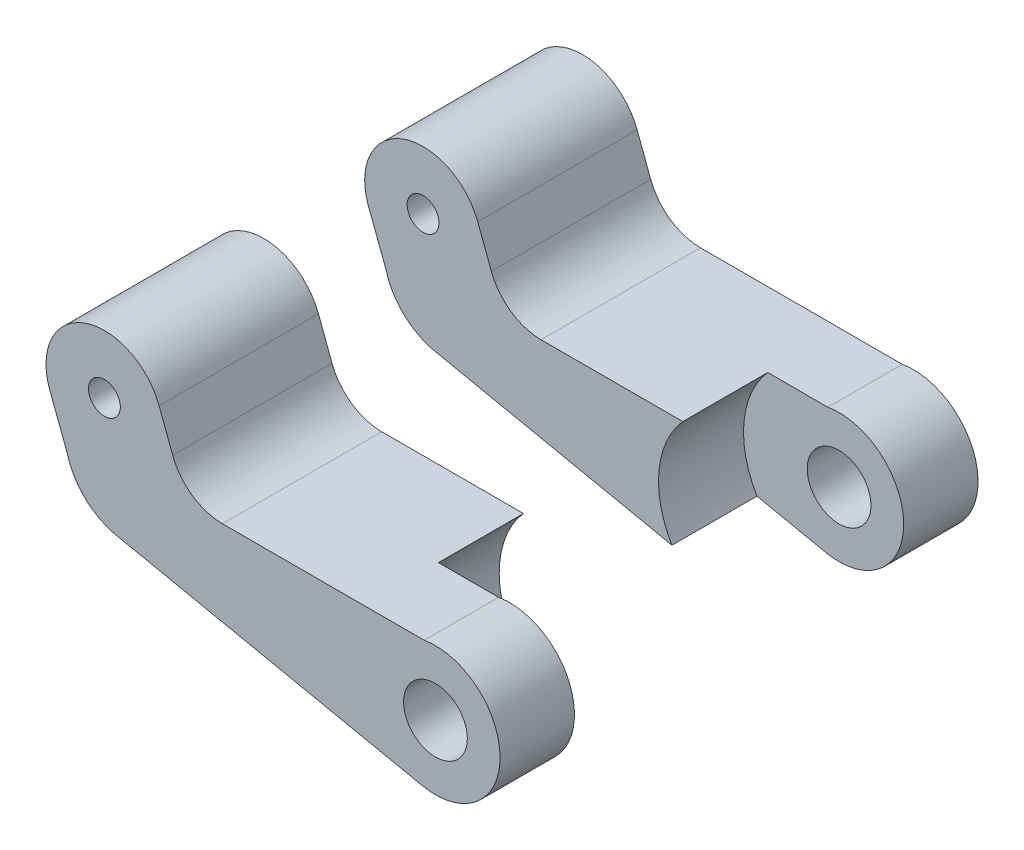
ISO-10303-21;
HEADER;
FILE_DESCRIPTION(('STEP AP214'),'2;1');
FILE_NAME('part.step','',(''),(''),'','','');
FILE_SCHEMA(('AUTOMOTIVE_DESIGN { 1 0 10303 214 1 1 1 1 }'));
ENDSEC;
DATA;
#1=APPLICATION_CONTEXT('core data for automotive mechanical design processes');
#2=APPLICATION_PROTOCOL_DEFINITION('international standard','automotive_design',2000,#1);
#3=PRODUCT_CONTEXT('',#1,'mechanical');
#4=PRODUCT('Part','Part','',(#3));
#5=PRODUCT_RELATED_PRODUCT_CATEGORY('part','',(#4));
#6=PRODUCT_DEFINITION_FORMATION('','',#4);
#7=PRODUCT_DEFINITION_CONTEXT('part definition',#1,'design');
#8=PRODUCT_DEFINITION('design','',#6,#7);
#9=PRODUCT_DEFINITION_SHAPE('','',#8);
#10=(LENGTH_UNIT() NAMED_UNIT(*) SI_UNIT(.MILLI.,.METRE.));
#11=(NAMED_UNIT(*) PLANE_ANGLE_UNIT() SI_UNIT($,.RADIAN.));
#12=(NAMED_UNIT(*) SI_UNIT($,.STERADIAN.) SOLID_ANGLE_UNIT());
#13=UNCERTAINTY_MEASURE_WITH_UNIT(LENGTH_MEASURE(1.E-05),#10,'distance_accuracy_value','');
#14=(GEOMETRIC_REPRESENTATION_CONTEXT(3) GLOBAL_UNCERTAINTY_ASSIGNED_CONTEXT((#13)) GLOBAL_UNIT_ASSIGNED_CONTEXT((#10,
#11,#12)) REPRESENTATION_CONTEXT('',''));
#15=CARTESIAN_POINT('',(0.,0.,0.));
#16=DIRECTION('',(0.,0.,1.));
#17=DIRECTION('',(1.,0.,0.));
#18=AXIS2_PLACEMENT_3D('',#15,#16,#17);
#19=CARTESIAN_POINT('',(10.904911352008,28.2789430406225,45.0000000000001));
#20=DIRECTION('',(0.,0.,-1.));
#21=DIRECTION('',(-0.999999999999999,0.,0.));
#22=AXIS2_PLACEMENT_3D('',#19,#20,#21);
#23=CYLINDRICAL_SURFACE('',#22,6.08272301088786);
#24=CARTESIAN_POINT('',(10.904911352008,28.2789430406226,38.));
#25=DIRECTION('',(0.,0.,-1.));
#26=DIRECTION('',(-0.999999999999999,0.,0.));
#27=AXIS2_PLACEMENT_3D('',#24,#25,#26);
#28=CIRCLE('',#27,6.08272301088786);
#29=CARTESIAN_POINT('',(9.84652905516686,34.2688801138243,38.));
#30=VERTEX_POINT('',#29);
#31=CARTESIAN_POINT('',(9.6628559040576,22.3243802950128,38.));
#32=VERTEX_POINT('',#31);
#33=EDGE_CURVE('E264',#30,#32,#28,.T.);
#34=ORIENTED_EDGE('',*,*,#33,.F.);
#35=DIRECTION('',(0.,0.,-1.));
#36=VECTOR('',#35,1.);
#37=CARTESIAN_POINT('',(9.84652905516691,34.2688801138243,45.));
#38=LINE('',#37,#36);
#39=CARTESIAN_POINT('',(9.84652905516691,34.2688801138243,45.));
#40=VERTEX_POINT('',#39);
#41=EDGE_CURVE('E151',#40,#30,#38,.T.);
#42=ORIENTED_EDGE('',*,*,#41,.F.);
#43=CARTESIAN_POINT('',(10.904911352008,28.2789430406225,45.0000000000001));
#44=DIRECTION('',(0.,0.,1.));
#45=DIRECTION('',(0.999999999999999,0.,0.));
#46=AXIS2_PLACEMENT_3D('',#43,#44,#45);
#47=CIRCLE('',#46,6.08272301088786);
#48=CARTESIAN_POINT('',(9.66285590405747,22.3243802950129,45.0000000000001));
#49=VERTEX_POINT('',#48);
#50=EDGE_CURVE('E131',#49,#40,#47,.T.);
#51=ORIENTED_EDGE('',*,*,#50,.F.);
#52=DIRECTION('',(0.,0.,-1.));
#53=VECTOR('',#52,1.);
#54=CARTESIAN_POINT('',(9.66285590405747,22.3243802950129,45.0000000000001));
#55=LINE('',#54,#53);
#56=EDGE_CURVE('E142',#49,#32,#55,.T.);
#57=ORIENTED_EDGE('',*,*,#56,.T.);
#58=EDGE_LOOP('',(#34,#42,#51,#57));
#59=FACE_BOUND('',#58,.T.);
#60=ADVANCED_FACE('F50',(#59),#23,.T.);
#61=CARTESIAN_POINT('',(-9.15371136013948,39.2688801138245,45.));
#62=DIRECTION('',(0.,0.,-1.));
#63=DIRECTION('',(-0.999999999999999,0.,0.));
#64=AXIS2_PLACEMENT_3D('',#61,#62,#63);
#65=CYLINDRICAL_SURFACE('',#64,5.00000000000007);
#66=CARTESIAN_POINT('',(-9.15371136013957,39.2688801138244,30.0000000000001));
#67=DIRECTION('',(0.,0.,-1.));
#68=DIRECTION('',(0.999999999999999,0.,0.));
#69=AXIS2_PLACEMENT_3D('',#66,#67,#68);
#70=CIRCLE('',#69,5.00000000000007);
#71=CARTESIAN_POINT('',(-9.15371136013943,34.2688801138245,30.));
#72=VERTEX_POINT('',#71);
#73=CARTESIAN_POINT('',(-13.8342690335148,37.5103637316976,30.0000000000001));
#74=VERTEX_POINT('',#73);
#75=EDGE_CURVE('E162',#72,#74,#70,.T.);
#76=ORIENTED_EDGE('',*,*,#75,.T.);
#77=DIRECTION('',(0.,0.,-1.));
#78=VECTOR('',#77,1.);
#79=CARTESIAN_POINT('',(-13.8342690335149,37.5103637316976,45.0000000000001));
#80=LINE('',#79,#78);
#81=CARTESIAN_POINT('',(-13.8342690335149,37.5103637316976,45.0000000000001));
#82=VERTEX_POINT('',#81);
#83=EDGE_CURVE('E203',#82,#74,#80,.T.);
#84=ORIENTED_EDGE('',*,*,#83,.F.);
#85=CARTESIAN_POINT('',(-9.15371136013948,39.2688801138245,45.));
#86=DIRECTION('',(0.,0.,-1.));
#87=DIRECTION('',(0.999999999999999,0.,0.));
#88=AXIS2_PLACEMENT_3D('',#85,#86,#87);
#89=CIRCLE('',#88,5.00000000000007);
#90=CARTESIAN_POINT('',(-9.15371136013965,34.2688801138245,45.0000000000001));
#91=VERTEX_POINT('',#90);
#92=EDGE_CURVE('E184',#91,#82,#89,.T.);
#93=ORIENTED_EDGE('',*,*,#92,.F.);
#94=DIRECTION('',(0.,0.,-1.));
#95=VECTOR('',#94,1.);
#96=CARTESIAN_POINT('',(-9.15371136013965,34.2688801138245,45.0000000000001));
#97=LINE('',#96,#95);
#98=EDGE_CURVE('E158',#91,#72,#97,.T.);
#99=ORIENTED_EDGE('',*,*,#98,.T.);
#100=EDGE_LOOP('',(#76,#84,#93,#99));
#101=FACE_BOUND('',#100,.T.);
#102=ADVANCED_FACE('F52',(#101),#65,.F.);
#103=CARTESIAN_POINT('',(-15.110783355538,40.9079999242555,45.));
#104=DIRECTION('',(-0.936111534675055,-0.351703276425331,0.));
#105=DIRECTION('',(0.351703276425328,-0.936111534675056,0.));
#106=AXIS2_PLACEMENT_3D('',#103,#104,#105);
#107=PLANE('',#106);
#108=DIRECTION('',(-0.351703276425328,0.936111534675056,0.));
#109=VECTOR('',#108,1.);
#110=CARTESIAN_POINT('',(-15.1107833555379,40.9079999242554,30.0000000000001));
#111=LINE('',#110,#109);
#112=CARTESIAN_POINT('',(-15.1107833555379,40.9079999242554,30.0000000000001));
#113=VERTEX_POINT('',#112);
#114=EDGE_CURVE('E166',#74,#113,#111,.T.);
#115=ORIENTED_EDGE('',*,*,#114,.T.);
#116=DIRECTION('',(0.,0.,-1.));
#117=VECTOR('',#116,1.);
#118=CARTESIAN_POINT('',(-15.110783355538,40.9079999242555,45.));
#119=LINE('',#118,#117);
#120=CARTESIAN_POINT('',(-15.110783355538,40.9079999242555,45.));
#121=VERTEX_POINT('',#120);
#122=EDGE_CURVE('E199',#121,#113,#119,.T.);
#123=ORIENTED_EDGE('',*,*,#122,.F.);
#124=DIRECTION('',(-0.351703276425328,0.936111534675056,0.));
#125=VECTOR('',#124,1.);
#126=CARTESIAN_POINT('',(-15.110783355538,40.9079999242555,45.));
#127=LINE('',#126,#125);
#128=EDGE_CURVE('E112',#82,#121,#127,.T.);
#129=ORIENTED_EDGE('',*,*,#128,.F.);
#130=ORIENTED_EDGE('',*,*,#83,.T.);
#131=EDGE_LOOP('',(#115,#123,#129,#130));
#132=FACE_BOUND('',#131,.T.);
#133=ADVANCED_FACE('F234',(#132),#107,.F.);
#134=CARTESIAN_POINT('',(-20.2593967962508,38.9736319039162,45.0000000000001));
#135=DIRECTION('',(0.,0.,-1.));
#136=DIRECTION('',(-0.999999999999999,0.,0.));
#137=AXIS2_PLACEMENT_3D('',#134,#135,#136);
#138=CYLINDRICAL_SURFACE('',#137,5.5);
#139=CARTESIAN_POINT('',(-20.2593967962509,38.9736319039162,30.0000000000001));
#140=DIRECTION('',(0.,0.,1.));
#141=DIRECTION('',(0.999999999999999,0.,0.));
#142=AXIS2_PLACEMENT_3D('',#139,#140,#141);
#143=CIRCLE('',#142,5.5);
#144=CARTESIAN_POINT('',(-25.4080102369636,37.0392638835769,30.0000000000001));
#145=VERTEX_POINT('',#144);
#146=EDGE_CURVE('E170',#113,#145,#143,.T.);
#147=ORIENTED_EDGE('',*,*,#146,.T.);
#148=DIRECTION('',(0.,0.,-1.));
#149=VECTOR('',#148,1.);
#150=CARTESIAN_POINT('',(-25.4080102369636,37.0392638835769,45.));
#151=LINE('',#150,#149);
#152=CARTESIAN_POINT('',(-25.4080102369636,37.0392638835769,45.));
#153=VERTEX_POINT('',#152);
#154=EDGE_CURVE('E195',#153,#145,#151,.T.);
#155=ORIENTED_EDGE('',*,*,#154,.F.);
#156=CARTESIAN_POINT('',(-20.2593967962508,38.9736319039162,45.0000000000001));
#157=DIRECTION('',(0.,0.,1.));
#158=DIRECTION('',(0.999999999999999,0.,0.));
#159=AXIS2_PLACEMENT_3D('',#156,#157,#158);
#160=CIRCLE('',#159,5.5);
#161=EDGE_CURVE('E233',#121,#153,#160,.T.);
#162=ORIENTED_EDGE('',*,*,#161,.F.);
#163=ORIENTED_EDGE('',*,*,#122,.T.);
#164=EDGE_LOOP('',(#147,#155,#162,#163));
#165=FACE_BOUND('',#164,.T.);
#166=ADVANCED_FACE('F232',(#165),#138,.T.);
#167=CARTESIAN_POINT('',(-25.4080102369636,37.0392638835769,45.));
#168=DIRECTION('',(0.934187644696389,0.356782068630996,0.));
#169=DIRECTION('',(-0.356782068630993,0.93418764469639,0.));
#170=AXIS2_PLACEMENT_3D('',#167,#168,#169);
#171=PLANE('',#170);
#172=DIRECTION('',(0.356782068630993,-0.93418764469639,0.));
#173=VECTOR('',#172,1.);
#174=CARTESIAN_POINT('',(-25.4080102369636,37.0392638835769,30.0000000000001));
#175=LINE('',#174,#173);
#176=CARTESIAN_POINT('',(-23.7697916075503,32.7498005459665,30.0000000000001));
#177=VERTEX_POINT('',#176);
#178=EDGE_CURVE('E173',#145,#177,#175,.T.);
#179=ORIENTED_EDGE('',*,*,#178,.T.);
#180=DIRECTION('',(0.,0.,-1.));
#181=VECTOR('',#180,1.);
#182=CARTESIAN_POINT('',(-23.7697916075503,32.7498005459665,45.0000000000001));
#183=LINE('',#182,#181);
#184=CARTESIAN_POINT('',(-23.7697916075503,32.7498005459665,45.0000000000001));
#185=VERTEX_POINT('',#184);
#186=EDGE_CURVE('E191',#185,#177,#183,.T.);
#187=ORIENTED_EDGE('',*,*,#186,.F.);
#188=DIRECTION('',(0.356782068630993,-0.93418764469639,0.));
#189=VECTOR('',#188,1.);
#190=CARTESIAN_POINT('',(-25.4080102369636,37.0392638835769,45.));
#191=LINE('',#190,#189);
#192=EDGE_CURVE('E229',#153,#185,#191,.T.);
#193=ORIENTED_EDGE('',*,*,#192,.F.);
#194=ORIENTED_EDGE('',*,*,#154,.T.);
#195=EDGE_LOOP('',(#179,#187,#193,#194));
#196=FACE_BOUND('',#195,.T.);
#197=ADVANCED_FACE('F226',(#196),#171,.F.);
#198=CARTESIAN_POINT('',(-17.8652762124996,34.2915409970844,45.0000000000001));
#199=DIRECTION('',(0.,0.,-1.));
#200=DIRECTION('',(-0.999999999999999,0.,0.));
#201=AXIS2_PLACEMENT_3D('',#198,#199,#200);
#202=CYLINDRICAL_SURFACE('',#201,6.10248028829284);
#203=CARTESIAN_POINT('',(-17.8652762124996,34.2915409970844,30.0000000000001));
#204=DIRECTION('',(0.,0.,1.));
#205=DIRECTION('',(-0.999999999999999,0.,0.));
#206=AXIS2_PLACEMENT_3D('',#203,#204,#205);
#207=CIRCLE('',#206,6.10248028829284);
#208=CARTESIAN_POINT('',(-18.7936631500779,28.2600931308469,30.0000000000001));
#209=VERTEX_POINT('',#208);
#210=EDGE_CURVE('E176',#177,#209,#207,.T.);
#211=ORIENTED_EDGE('',*,*,#210,.T.);
#212=DIRECTION('',(0.,0.,-1.));
#213=VECTOR('',#212,1.);
#214=CARTESIAN_POINT('',(-18.7936631500779,28.260093130847,45.));
#215=LINE('',#214,#213);
#216=CARTESIAN_POINT('',(-18.7936631500779,28.260093130847,45.));
#217=VERTEX_POINT('',#216);
#218=EDGE_CURVE('E150',#217,#209,#215,.T.);
#219=ORIENTED_EDGE('',*,*,#218,.F.);
#220=CARTESIAN_POINT('',(-17.8652762124996,34.2915409970844,45.0000000000001));
#221=DIRECTION('',(0.,0.,1.));
#222=DIRECTION('',(-0.999999999999999,0.,0.));
#223=AXIS2_PLACEMENT_3D('',#220,#221,#222);
#224=CIRCLE('',#223,6.10248028829284);
#225=EDGE_CURVE('E134',#185,#217,#224,.T.);
#226=ORIENTED_EDGE('',*,*,#225,.F.);
#227=ORIENTED_EDGE('',*,*,#186,.T.);
#228=EDGE_LOOP('',(#211,#219,#226,#227));
#229=FACE_BOUND('',#228,.T.);
#230=ADVANCED_FACE('F221',(#229),#202,.T.);
#231=CARTESIAN_POINT('',(-18.7936631500779,28.260093130847,45.));
#232=DIRECTION('',(0.204193984458477,0.978930445287597,0.));
#233=DIRECTION('',(-0.978930445287595,0.204193984458475,0.));
#234=AXIS2_PLACEMENT_3D('',#231,#232,#233);
#235=PLANE('',#234);
#236=DIRECTION('',(0.978930445287595,-0.204193984458475,0.));
#237=VECTOR('',#236,1.);
#238=CARTESIAN_POINT('',(-18.7936631500779,28.2600931308469,30.0000000000001));
#239=LINE('',#238,#237);
#240=CARTESIAN_POINT('',(3.16933046234349,23.6788573566968,30.0000000000001));
#241=VERTEX_POINT('',#240);
#242=EDGE_CURVE('E179',#209,#241,#239,.T.);
#243=ORIENTED_EDGE('',*,*,#242,.T.);
#244=DIRECTION('',(0.,0.,-1.));
#245=VECTOR('',#244,1.);
#246=CARTESIAN_POINT('',(3.16933046234352,23.6788573566968,38.));
#247=LINE('',#246,#245);
#248=CARTESIAN_POINT('',(3.16933046234352,23.6788573566968,38.));
#249=VERTEX_POINT('',#248);
#250=EDGE_CURVE('E67',#241,#249,#247,.F.);
#251=ORIENTED_EDGE('',*,*,#250,.T.);
#252=DIRECTION('',(-0.978930445287595,0.204193984458475,0.));
#253=VECTOR('',#252,1.);
#254=CARTESIAN_POINT('',(-18.7936631500779,28.260093130847,38.));
#255=LINE('',#254,#253);
#256=EDGE_CURVE('E146',#32,#249,#255,.T.);
#257=ORIENTED_EDGE('',*,*,#256,.F.);
#258=ORIENTED_EDGE('',*,*,#56,.F.);
#259=DIRECTION('',(0.978930445287595,-0.204193984458475,0.));
#260=VECTOR('',#259,1.);
#261=CARTESIAN_POINT('',(-18.7936631500779,28.260093130847,45.));
#262=LINE('',#261,#260);
#263=EDGE_CURVE('E127',#217,#49,#262,.T.);
#264=ORIENTED_EDGE('',*,*,#263,.F.);
#265=ORIENTED_EDGE('',*,*,#218,.T.);
#266=EDGE_LOOP('',(#243,#251,#257,#258,#264,#265));
#267=FACE_BOUND('',#266,.T.);
#268=ADVANCED_FACE('F144',(#267),#235,.F.);
#269=CARTESIAN_POINT('',(-9.15371136013965,34.2688801138245,45.0000000000001));
#270=DIRECTION('',(0.,-1.,0.));
#271=DIRECTION('',(0.999999999999999,0.,0.));
#272=AXIS2_PLACEMENT_3D('',#269,#270,#271);
#273=PLANE('',#272);
#274=DIRECTION('',(0.999999999999999,0.,0.));
#275=VECTOR('',#274,1.);
#276=CARTESIAN_POINT('',(-9.15371136013954,34.2688801138244,38.0000000000001));
#277=LINE('',#276,#275);
#278=CARTESIAN_POINT('',(4.18772043175851,34.2688801138243,38.0000000000001));
#279=VERTEX_POINT('',#278);
#280=EDGE_CURVE('E12',#279,#30,#277,.T.);
#281=ORIENTED_EDGE('',*,*,#280,.F.);
#282=DIRECTION('',(0.,0.,-1.));
#283=VECTOR('',#282,1.);
#284=CARTESIAN_POINT('',(4.18772043175851,34.2688801138243,38.0000000000001));
#285=LINE('',#284,#283);
#286=CARTESIAN_POINT('',(4.1877204317585,34.2688801138244,30.0000000000001));
#287=VERTEX_POINT('',#286);
#288=EDGE_CURVE('E248',#279,#287,#285,.T.);
#289=ORIENTED_EDGE('',*,*,#288,.T.);
#290=DIRECTION('',(-0.999999999999999,0.,0.));
#291=VECTOR('',#290,1.);
#292=CARTESIAN_POINT('',(-9.15371136013943,34.2688801138245,30.));
#293=LINE('',#292,#291);
#294=EDGE_CURVE('E103',#287,#72,#293,.T.);
#295=ORIENTED_EDGE('',*,*,#294,.T.);
#296=ORIENTED_EDGE('',*,*,#98,.F.);
#297=DIRECTION('',(-0.999999999999999,0.,0.));
#298=VECTOR('',#297,1.);
#299=CARTESIAN_POINT('',(-9.15371136013965,34.2688801138245,45.0000000000001));
#300=LINE('',#299,#298);
#301=EDGE_CURVE('E76',#40,#91,#300,.T.);
#302=ORIENTED_EDGE('',*,*,#301,.F.);
#303=ORIENTED_EDGE('',*,*,#41,.T.);
#304=EDGE_LOOP('',(#281,#289,#295,#296,#302,#303));
#305=FACE_BOUND('',#304,.T.);
#306=ADVANCED_FACE('F239',(#305),#273,.F.);
#307=CARTESIAN_POINT('',(-9.15371136013948,39.2688801138245,45.));
#308=DIRECTION('',(0.,0.,1.));
#309=DIRECTION('',(0.999999999999999,0.,0.));
#310=AXIS2_PLACEMENT_3D('',#307,#308,#309);
#311=PLANE('',#310);
#312=CARTESIAN_POINT('',(10.904911352008,28.2789430406225,45.0000000000001));
#313=DIRECTION('',(0.,0.,1.));
#314=DIRECTION('',(0.999999999999999,0.,0.));
#315=AXIS2_PLACEMENT_3D('',#312,#313,#314);
#316=CIRCLE('',#315,3.);
#317=CARTESIAN_POINT('',(13.904911352008,28.2789430406225,45.0000000000001));
#318=VERTEX_POINT('',#317);
#319=EDGE_CURVE('E255',#318,#318,#316,.F.);
#320=ORIENTED_EDGE('',*,*,#319,.T.);
#321=EDGE_LOOP('',(#320));
#322=FACE_BOUND('',#321,.T.);
#323=CARTESIAN_POINT('',(-20.2593967962508,38.9736319039162,45.0000000000001));
#324=DIRECTION('',(0.,0.,1.));
#325=DIRECTION('',(0.999999999999999,0.,0.));
#326=AXIS2_PLACEMENT_3D('',#323,#324,#325);
#327=CIRCLE('',#326,1.5);
#328=CARTESIAN_POINT('',(-18.7593967962508,38.9736319039162,45.0000000000001));
#329=VERTEX_POINT('',#328);
#330=EDGE_CURVE('E209',#329,#329,#327,.T.);
#331=ORIENTED_EDGE('',*,*,#330,.F.);
#332=EDGE_LOOP('',(#331));
#333=FACE_BOUND('',#332,.T.);
#334=ORIENTED_EDGE('',*,*,#92,.T.);
#335=ORIENTED_EDGE('',*,*,#128,.T.);
#336=ORIENTED_EDGE('',*,*,#161,.T.);
#337=ORIENTED_EDGE('',*,*,#192,.T.);
#338=ORIENTED_EDGE('',*,*,#225,.T.);
#339=ORIENTED_EDGE('',*,*,#263,.T.);
#340=ORIENTED_EDGE('',*,*,#50,.T.);
#341=ORIENTED_EDGE('',*,*,#301,.T.);
#342=EDGE_LOOP('',(#334,#335,#336,#337,#338,#339,#340,#341));
#343=FACE_BOUND('',#342,.T.);
#344=ADVANCED_FACE('F129',(#322,#333,#343),#311,.T.);
#345=CARTESIAN_POINT('',(-9.15371136013957,39.2688801138244,30.0000000000001));
#346=DIRECTION('',(0.,0.,1.));
#347=DIRECTION('',(0.999999999999999,0.,0.));
#348=AXIS2_PLACEMENT_3D('',#345,#346,#347);
#349=PLANE('',#348);
#350=CARTESIAN_POINT('',(-20.2593967962509,38.9736319039162,30.0000000000001));
#351=DIRECTION('',(0.,0.,1.));
#352=DIRECTION('',(0.999999999999999,0.,0.));
#353=AXIS2_PLACEMENT_3D('',#350,#351,#352);
#354=CIRCLE('',#353,1.5);
#355=CARTESIAN_POINT('',(-18.7593967962509,38.9736319039162,30.0000000000001));
#356=VERTEX_POINT('',#355);
#357=EDGE_CURVE('E167',#356,#356,#354,.T.);
#358=ORIENTED_EDGE('',*,*,#357,.T.);
#359=EDGE_LOOP('',(#358));
#360=FACE_BOUND('',#359,.T.);
#361=ORIENTED_EDGE('',*,*,#294,.F.);
#362=CARTESIAN_POINT('',(10.904911352008,28.2789430406225,30.));
#363=DIRECTION('',(0.,0.,1.));
#364=DIRECTION('',(0.999999999999999,0.,0.));
#365=AXIS2_PLACEMENT_3D('',#362,#363,#364);
#366=CIRCLE('',#365,9.);
#367=EDGE_CURVE('E60',#287,#241,#366,.T.);
#368=ORIENTED_EDGE('',*,*,#367,.T.);
#369=ORIENTED_EDGE('',*,*,#242,.F.);
#370=ORIENTED_EDGE('',*,*,#210,.F.);
#371=ORIENTED_EDGE('',*,*,#178,.F.);
#372=ORIENTED_EDGE('',*,*,#146,.F.);
#373=ORIENTED_EDGE('',*,*,#114,.F.);
#374=ORIENTED_EDGE('',*,*,#75,.F.);
#375=EDGE_LOOP('',(#361,#368,#369,#370,#371,#372,#373,#374));
#376=FACE_BOUND('',#375,.T.);
#377=ADVANCED_FACE('F214',(#360,#376),#349,.F.);
#378=CARTESIAN_POINT('',(-20.2593967962508,38.9736319039161,27.));
#379=DIRECTION('',(0.,0.,1.));
#380=DIRECTION('',(0.999999999999999,0.,0.));
#381=AXIS2_PLACEMENT_3D('',#378,#379,#380);
#382=CYLINDRICAL_SURFACE('',#381,1.5);
#383=ORIENTED_EDGE('',*,*,#330,.T.);
#384=EDGE_LOOP('',(#383));
#385=FACE_BOUND('',#384,.T.);
#386=ORIENTED_EDGE('',*,*,#357,.F.);
#387=EDGE_LOOP('',(#386));
#388=FACE_BOUND('',#387,.T.);
#389=ADVANCED_FACE('F301',(#385,#388),#382,.F.);
#390=CARTESIAN_POINT('',(10.904911352008,28.2789430406226,38.));
#391=DIRECTION('',(0.,0.,-1.));
#392=DIRECTION('',(-0.999999999999999,0.,0.));
#393=AXIS2_PLACEMENT_3D('',#390,#391,#392);
#394=PLANE('',#393);
#395=CARTESIAN_POINT('',(10.904911352008,28.2789430406226,38.));
#396=DIRECTION('',(0.,0.,-1.));
#397=DIRECTION('',(-0.999999999999999,0.,0.));
#398=AXIS2_PLACEMENT_3D('',#395,#396,#397);
#399=CIRCLE('',#398,3.);
#400=CARTESIAN_POINT('',(7.90491135200801,28.2789430406226,38.));
#401=VERTEX_POINT('',#400);
#402=EDGE_CURVE('E54',#401,#401,#399,.F.);
#403=ORIENTED_EDGE('',*,*,#402,.T.);
#404=EDGE_LOOP('',(#403));
#405=FACE_BOUND('',#404,.T.);
#406=ORIENTED_EDGE('',*,*,#256,.T.);
#407=CARTESIAN_POINT('',(10.904911352008,28.2789430406226,38.));
#408=DIRECTION('',(0.,0.,-1.));
#409=DIRECTION('',(-0.999999999999999,0.,0.));
#410=AXIS2_PLACEMENT_3D('',#407,#408,#409);
#411=CIRCLE('',#410,9.);
#412=EDGE_CURVE('E250',#249,#279,#411,.T.);
#413=ORIENTED_EDGE('',*,*,#412,.T.);
#414=ORIENTED_EDGE('',*,*,#280,.T.);
#415=ORIENTED_EDGE('',*,*,#33,.T.);
#416=EDGE_LOOP('',(#406,#413,#414,#415));
#417=FACE_BOUND('',#416,.T.);
#418=ADVANCED_FACE('F253',(#405,#417),#394,.T.);
#419=CARTESIAN_POINT('',(10.904911352008,28.2789430406226,38.));
#420=DIRECTION('',(0.,0.,-1.));
#421=DIRECTION('',(-0.999999999999999,0.,0.));
#422=AXIS2_PLACEMENT_3D('',#419,#420,#421);
#423=CYLINDRICAL_SURFACE('',#422,9.);
#424=ORIENTED_EDGE('',*,*,#367,.F.);
#425=ORIENTED_EDGE('',*,*,#288,.F.);
#426=ORIENTED_EDGE('',*,*,#412,.F.);
#427=ORIENTED_EDGE('',*,*,#250,.F.);
#428=EDGE_LOOP('',(#424,#425,#426,#427));
#429=FACE_BOUND('',#428,.T.);
#430=ADVANCED_FACE('F249',(#429),#423,.F.);
#431=CARTESIAN_POINT('',(10.9049113520081,28.2789430406225,-9.99999999999997));
#432=DIRECTION('',(0.,0.,1.));
#433=DIRECTION('',(0.999999999999999,0.,0.));
#434=AXIS2_PLACEMENT_3D('',#431,#432,#433);
#435=CYLINDRICAL_SURFACE('',#434,3.);
#436=ORIENTED_EDGE('',*,*,#319,.F.);
#437=EDGE_LOOP('',(#436));
#438=FACE_BOUND('',#437,.T.);
#439=ORIENTED_EDGE('',*,*,#402,.F.);
#440=EDGE_LOOP('',(#439));
#441=FACE_BOUND('',#440,.T.);
#442=ADVANCED_FACE('F388',(#438,#441),#435,.F.);
#443=CLOSED_SHELL('',(#60,#102,#133,#166,#197,#230,#268,#306,#344,#377,#389,#418,#430,#442));
#444=MANIFOLD_SOLID_BREP('B2',#443);
#445=CARTESIAN_POINT('',(-18.7936631500779,28.2600931308469,15.));
#446=DIRECTION('',(0.204193984458477,0.978930445287597,0.));
#447=DIRECTION('',(-0.978930445287595,0.204193984458475,0.));
#448=AXIS2_PLACEMENT_3D('',#445,#446,#447);
#449=PLANE('',#448);
#450=DIRECTION('',(0.,0.,-1.));
#451=VECTOR('',#450,1.);
#452=CARTESIAN_POINT('',(3.16933046234363,23.6788573566968,84.0000000000002));
#453=LINE('',#452,#451);
#454=CARTESIAN_POINT('',(3.16933046234359,23.6788573566968,15.));
#455=VERTEX_POINT('',#454);
#456=CARTESIAN_POINT('',(3.16933046234359,23.6788573566968,7.00000000000003));
#457=VERTEX_POINT('',#456);
#458=EDGE_CURVE('E665',#455,#457,#453,.T.);
#459=ORIENTED_EDGE('',*,*,#458,.F.);
#460=DIRECTION('',(0.978930445287595,-0.204193984458475,0.));
#461=VECTOR('',#460,1.);
#462=CARTESIAN_POINT('',(-18.7936631500779,28.2600931308469,15.));
#463=LINE('',#462,#461);
#464=CARTESIAN_POINT('',(-18.7936631500779,28.2600931308469,15.));
#465=VERTEX_POINT('',#464);
#466=EDGE_CURVE('E572',#465,#455,#463,.T.);
#467=ORIENTED_EDGE('',*,*,#466,.F.);
#468=DIRECTION('',(0.,0.,-1.));
#469=VECTOR('',#468,1.);
#470=CARTESIAN_POINT('',(-18.7936631500779,28.2600931308469,15.));
#471=LINE('',#470,#469);
#472=CARTESIAN_POINT('',(-18.7936631500779,28.260093130847,0.));
#473=VERTEX_POINT('',#472);
#474=EDGE_CURVE('E566',#465,#473,#471,.T.);
#475=ORIENTED_EDGE('',*,*,#474,.T.);
#476=DIRECTION('',(0.978930445287595,-0.204193984458475,0.));
#477=VECTOR('',#476,1.);
#478=CARTESIAN_POINT('',(-18.7936631500779,28.260093130847,0.));
#479=LINE('',#478,#477);
#480=CARTESIAN_POINT('',(9.66285590405759,22.3243802950128,0.));
#481=VERTEX_POINT('',#480);
#482=EDGE_CURVE('E598',#473,#481,#479,.T.);
#483=ORIENTED_EDGE('',*,*,#482,.T.);
#484=DIRECTION('',(0.,0.,-1.));
#485=VECTOR('',#484,1.);
#486=CARTESIAN_POINT('',(9.66285590405747,22.3243802950128,15.));
#487=LINE('',#486,#485);
#488=CARTESIAN_POINT('',(9.66285590405759,22.324380295013,7.00000000000003));
#489=VERTEX_POINT('',#488);
#490=EDGE_CURVE('E614',#489,#481,#487,.T.);
#491=ORIENTED_EDGE('',*,*,#490,.F.);
#492=DIRECTION('',(0.978930445287595,-0.204193984458475,0.));
#493=VECTOR('',#492,1.);
#494=CARTESIAN_POINT('',(-18.793663150078,28.260093130847,7.00000000000002));
#495=LINE('',#494,#493);
#496=EDGE_CURVE('E657',#457,#489,#495,.T.);
#497=ORIENTED_EDGE('',*,*,#496,.F.);
#498=EDGE_LOOP('',(#459,#467,#475,#483,#491,#497));
#499=FACE_BOUND('',#498,.T.);
#500=ADVANCED_FACE('F467',(#499),#449,.F.);
#501=CARTESIAN_POINT('',(10.9049113520081,28.2789430406225,15.));
#502=DIRECTION('',(0.,0.,-1.));
#503=DIRECTION('',(-0.999999999999999,0.,0.));
#504=AXIS2_PLACEMENT_3D('',#501,#502,#503);
#505=CYLINDRICAL_SURFACE('',#504,6.08272301088786);
#506=CARTESIAN_POINT('',(10.904911352008,28.2789430406225,7.00000000000002));
#507=DIRECTION('',(0.,0.,1.));
#508=DIRECTION('',(0.999999999999999,0.,0.));
#509=AXIS2_PLACEMENT_3D('',#506,#507,#508);
#510=CIRCLE('',#509,6.08272301088786);
#511=CARTESIAN_POINT('',(9.84652905516691,34.2688801138243,7.00000000000003));
#512=VERTEX_POINT('',#511);
#513=EDGE_CURVE('E661',#489,#512,#510,.T.);
#514=ORIENTED_EDGE('',*,*,#513,.F.);
#515=ORIENTED_EDGE('',*,*,#490,.T.);
#516=CARTESIAN_POINT('',(10.904911352008,28.2789430406225,0.));
#517=DIRECTION('',(0.,0.,1.));
#518=DIRECTION('',(0.999999999999999,0.,0.));
#519=AXIS2_PLACEMENT_3D('',#516,#517,#518);
#520=CIRCLE('',#519,6.08272301088786);
#521=CARTESIAN_POINT('',(9.84652905516695,34.2688801138242,0.));
#522=VERTEX_POINT('',#521);
#523=EDGE_CURVE('E602',#481,#522,#520,.T.);
#524=ORIENTED_EDGE('',*,*,#523,.T.);
#525=DIRECTION('',(0.,0.,-1.));
#526=VECTOR('',#525,1.);
#527=CARTESIAN_POINT('',(9.84652905516678,34.2688801138243,15.));
#528=LINE('',#527,#526);
#529=EDGE_CURVE('E611',#512,#522,#528,.T.);
#530=ORIENTED_EDGE('',*,*,#529,.F.);
#531=EDGE_LOOP('',(#514,#515,#524,#530));
#532=FACE_BOUND('',#531,.T.);
#533=ADVANCED_FACE('F698',(#532),#505,.T.);
#534=CARTESIAN_POINT('',(-9.15371136013959,34.2688801138243,15.));
#535=DIRECTION('',(0.,-1.,0.));
#536=DIRECTION('',(0.999999999999999,0.,0.));
#537=AXIS2_PLACEMENT_3D('',#534,#535,#536);
#538=PLANE('',#537);
#539=DIRECTION('',(0.,0.,-1.));
#540=VECTOR('',#539,1.);
#541=CARTESIAN_POINT('',(4.18772043175843,34.2688801138243,84.0000000000001));
#542=LINE('',#541,#540);
#543=CARTESIAN_POINT('',(4.18772043175855,34.2688801138243,7.00000000000003));
#544=VERTEX_POINT('',#543);
#545=CARTESIAN_POINT('',(4.18772043175845,34.2688801138243,15.));
#546=VERTEX_POINT('',#545);
#547=EDGE_CURVE('E484',#544,#546,#542,.F.);
#548=ORIENTED_EDGE('',*,*,#547,.F.);
#549=DIRECTION('',(-0.999999999999999,0.,0.));
#550=VECTOR('',#549,1.);
#551=CARTESIAN_POINT('',(-9.15371136013954,34.2688801138244,7.00000000000002));
#552=LINE('',#551,#550);
#553=EDGE_CURVE('E48',#512,#544,#552,.T.);
#554=ORIENTED_EDGE('',*,*,#553,.F.);
#555=ORIENTED_EDGE('',*,*,#529,.T.);
#556=DIRECTION('',(-0.999999999999999,0.,0.));
#557=VECTOR('',#556,1.);
#558=CARTESIAN_POINT('',(-9.15371136013959,34.2688801138245,0.));
#559=LINE('',#558,#557);
#560=CARTESIAN_POINT('',(-9.15371136013959,34.2688801138245,0.));
#561=VERTEX_POINT('',#560);
#562=EDGE_CURVE('E525',#522,#561,#559,.T.);
#563=ORIENTED_EDGE('',*,*,#562,.T.);
#564=DIRECTION('',(0.,0.,-1.));
#565=VECTOR('',#564,1.);
#566=CARTESIAN_POINT('',(-9.15371136013959,34.2688801138243,15.));
#567=LINE('',#566,#565);
#568=CARTESIAN_POINT('',(-9.15371136013959,34.2688801138243,15.));
#569=VERTEX_POINT('',#568);
#570=EDGE_CURVE('E581',#569,#561,#567,.T.);
#571=ORIENTED_EDGE('',*,*,#570,.F.);
#572=DIRECTION('',(-0.999999999999999,0.,0.));
#573=VECTOR('',#572,1.);
#574=CARTESIAN_POINT('',(-9.15371136013959,34.2688801138243,15.));
#575=LINE('',#574,#573);
#576=EDGE_CURVE('E492',#546,#569,#575,.T.);
#577=ORIENTED_EDGE('',*,*,#576,.F.);
#578=EDGE_LOOP('',(#548,#554,#555,#563,#571,#577));
#579=FACE_BOUND('',#578,.T.);
#580=ADVANCED_FACE('F637',(#579),#538,.F.);
#581=CARTESIAN_POINT('',(-9.15371136013954,39.2688801138246,15.));
#582=DIRECTION('',(0.,0.,-1.));
#583=DIRECTION('',(-0.999999999999999,0.,0.));
#584=AXIS2_PLACEMENT_3D('',#581,#582,#583);
#585=CYLINDRICAL_SURFACE('',#584,5.00000000000007);
#586=CARTESIAN_POINT('',(-9.15371136013943,39.2688801138245,0.));
#587=DIRECTION('',(0.,0.,-1.));
#588=DIRECTION('',(0.999999999999999,0.,0.));
#589=AXIS2_PLACEMENT_3D('',#586,#587,#588);
#590=CIRCLE('',#589,5.00000000000007);
#591=CARTESIAN_POINT('',(-13.8342690335148,37.5103637316978,0.));
#592=VERTEX_POINT('',#591);
#593=EDGE_CURVE('E582',#561,#592,#590,.T.);
#594=ORIENTED_EDGE('',*,*,#593,.T.);
#595=DIRECTION('',(0.,0.,-1.));
#596=VECTOR('',#595,1.);
#597=CARTESIAN_POINT('',(-13.8342690335148,37.5103637316977,15.0000000000001));
#598=LINE('',#597,#596);
#599=CARTESIAN_POINT('',(-13.8342690335148,37.5103637316977,15.0000000000001));
#600=VERTEX_POINT('',#599);
#601=EDGE_CURVE('E625',#600,#592,#598,.T.);
#602=ORIENTED_EDGE('',*,*,#601,.F.);
#603=CARTESIAN_POINT('',(-9.15371136013954,39.2688801138246,15.));
#604=DIRECTION('',(0.,0.,-1.));
#605=DIRECTION('',(0.999999999999999,0.,0.));
#606=AXIS2_PLACEMENT_3D('',#603,#604,#605);
#607=CIRCLE('',#606,5.00000000000007);
#608=EDGE_CURVE('E608',#569,#600,#607,.T.);
#609=ORIENTED_EDGE('',*,*,#608,.F.);
#610=ORIENTED_EDGE('',*,*,#570,.T.);
#611=EDGE_LOOP('',(#594,#602,#609,#610));
#612=FACE_BOUND('',#611,.T.);
#613=ADVANCED_FACE('F469',(#612),#585,.F.);
#614=CARTESIAN_POINT('',(-15.110783355538,40.9079999242555,15.));
#615=DIRECTION('',(-0.936111534675055,-0.351703276425331,0.));
#616=DIRECTION('',(0.351703276425328,-0.936111534675056,0.));
#617=AXIS2_PLACEMENT_3D('',#614,#615,#616);
#618=PLANE('',#617);
#619=DIRECTION('',(-0.351703276425328,0.936111534675056,0.));
#620=VECTOR('',#619,1.);
#621=CARTESIAN_POINT('',(-15.1107833555381,40.9079999242557,0.));
#622=LINE('',#621,#620);
#623=CARTESIAN_POINT('',(-15.1107833555381,40.9079999242557,0.));
#624=VERTEX_POINT('',#623);
#625=EDGE_CURVE('E586',#592,#624,#622,.T.);
#626=ORIENTED_EDGE('',*,*,#625,.T.);
#627=DIRECTION('',(0.,0.,-1.));
#628=VECTOR('',#627,1.);
#629=CARTESIAN_POINT('',(-15.110783355538,40.9079999242555,15.));
#630=LINE('',#629,#628);
#631=CARTESIAN_POINT('',(-15.110783355538,40.9079999242555,15.));
#632=VERTEX_POINT('',#631);
#633=EDGE_CURVE('E621',#632,#624,#630,.T.);
#634=ORIENTED_EDGE('',*,*,#633,.F.);
#635=DIRECTION('',(-0.351703276425328,0.936111534675056,0.));
#636=VECTOR('',#635,1.);
#637=CARTESIAN_POINT('',(-15.110783355538,40.9079999242555,15.));
#638=LINE('',#637,#636);
#639=EDGE_CURVE('E534',#600,#632,#638,.T.);
#640=ORIENTED_EDGE('',*,*,#639,.F.);
#641=ORIENTED_EDGE('',*,*,#601,.T.);
#642=EDGE_LOOP('',(#626,#634,#640,#641));
#643=FACE_BOUND('',#642,.T.);
#644=ADVANCED_FACE('F714',(#643),#618,.F.);
#645=CARTESIAN_POINT('',(-20.2593967962508,38.9736319039162,15.));
#646=DIRECTION('',(0.,0.,-1.));
#647=DIRECTION('',(-0.999999999999999,0.,0.));
#648=AXIS2_PLACEMENT_3D('',#645,#646,#647);
#649=CYLINDRICAL_SURFACE('',#648,5.5);
#650=CARTESIAN_POINT('',(-20.2593967962509,38.9736319039162,0.));
#651=DIRECTION('',(0.,0.,1.));
#652=DIRECTION('',(0.999999999999999,0.,0.));
#653=AXIS2_PLACEMENT_3D('',#650,#651,#652);
#654=CIRCLE('',#653,5.5);
#655=CARTESIAN_POINT('',(-25.4080102369635,37.0392638835769,0.));
#656=VERTEX_POINT('',#655);
#657=EDGE_CURVE('E590',#624,#656,#654,.T.);
#658=ORIENTED_EDGE('',*,*,#657,.T.);
#659=DIRECTION('',(0.,0.,-1.));
#660=VECTOR('',#659,1.);
#661=CARTESIAN_POINT('',(-25.4080102369636,37.0392638835768,15.0000000000001));
#662=LINE('',#661,#660);
#663=CARTESIAN_POINT('',(-25.4080102369636,37.0392638835768,15.0000000000001));
#664=VERTEX_POINT('',#663);
#665=EDGE_CURVE('E565',#664,#656,#662,.T.);
#666=ORIENTED_EDGE('',*,*,#665,.F.);
#667=CARTESIAN_POINT('',(-20.2593967962508,38.9736319039162,15.));
#668=DIRECTION('',(0.,0.,1.));
#669=DIRECTION('',(0.999999999999999,0.,0.));
#670=AXIS2_PLACEMENT_3D('',#667,#668,#669);
#671=CIRCLE('',#670,5.5);
#672=EDGE_CURVE('E551',#632,#664,#671,.T.);
#673=ORIENTED_EDGE('',*,*,#672,.F.);
#674=ORIENTED_EDGE('',*,*,#633,.T.);
#675=EDGE_LOOP('',(#658,#666,#673,#674));
#676=FACE_BOUND('',#675,.T.);
#677=ADVANCED_FACE('F712',(#676),#649,.T.);
#678=CARTESIAN_POINT('',(-25.4080102369636,37.0392638835768,15.0000000000001));
#679=DIRECTION('',(0.934187644696389,0.356782068630996,0.));
#680=DIRECTION('',(-0.356782068630993,0.93418764469639,0.));
#681=AXIS2_PLACEMENT_3D('',#678,#679,#680);
#682=PLANE('',#681);
#683=DIRECTION('',(0.356782068630993,-0.93418764469639,0.));
#684=VECTOR('',#683,1.);
#685=CARTESIAN_POINT('',(-25.4080102369635,37.0392638835769,0.));
#686=LINE('',#685,#684);
#687=CARTESIAN_POINT('',(-23.7697916075503,32.7498005459667,0.));
#688=VERTEX_POINT('',#687);
#689=EDGE_CURVE('E561',#656,#688,#686,.T.);
#690=ORIENTED_EDGE('',*,*,#689,.T.);
#691=DIRECTION('',(0.,0.,-1.));
#692=VECTOR('',#691,1.);
#693=CARTESIAN_POINT('',(-23.7697916075503,32.7498005459666,15.));
#694=LINE('',#693,#692);
#695=CARTESIAN_POINT('',(-23.7697916075503,32.7498005459666,15.));
#696=VERTEX_POINT('',#695);
#697=EDGE_CURVE('E558',#696,#688,#694,.T.);
#698=ORIENTED_EDGE('',*,*,#697,.F.);
#699=DIRECTION('',(0.356782068630993,-0.93418764469639,0.));
#700=VECTOR('',#699,1.);
#701=CARTESIAN_POINT('',(-25.4080102369636,37.0392638835768,15.0000000000001));
#702=LINE('',#701,#700);
#703=EDGE_CURVE('E543',#664,#696,#702,.T.);
#704=ORIENTED_EDGE('',*,*,#703,.F.);
#705=ORIENTED_EDGE('',*,*,#665,.T.);
#706=EDGE_LOOP('',(#690,#698,#704,#705));
#707=FACE_BOUND('',#706,.T.);
#708=ADVANCED_FACE('F559',(#707),#682,.F.);
#709=CARTESIAN_POINT('',(-17.8652762124996,34.2915409970841,15.));
#710=DIRECTION('',(0.,0.,-1.));
#711=DIRECTION('',(-0.999999999999999,0.,0.));
#712=AXIS2_PLACEMENT_3D('',#709,#710,#711);
#713=CYLINDRICAL_SURFACE('',#712,6.10248028829284);
#714=CARTESIAN_POINT('',(-17.8652762124996,34.2915409970843,0.));
#715=DIRECTION('',(0.,0.,1.));
#716=DIRECTION('',(-0.999999999999999,0.,0.));
#717=AXIS2_PLACEMENT_3D('',#714,#715,#716);
#718=CIRCLE('',#717,6.10248028829284);
#719=EDGE_CURVE('E595',#688,#473,#718,.T.);
#720=ORIENTED_EDGE('',*,*,#719,.T.);
#721=ORIENTED_EDGE('',*,*,#474,.F.);
#722=CARTESIAN_POINT('',(-17.8652762124996,34.2915409970841,15.));
#723=DIRECTION('',(0.,0.,1.));
#724=DIRECTION('',(-0.999999999999999,0.,0.));
#725=AXIS2_PLACEMENT_3D('',#722,#723,#724);
#726=CIRCLE('',#725,6.10248028829284);
#727=EDGE_CURVE('E548',#696,#465,#726,.T.);
#728=ORIENTED_EDGE('',*,*,#727,.F.);
#729=ORIENTED_EDGE('',*,*,#697,.T.);
#730=EDGE_LOOP('',(#720,#721,#728,#729));
#731=FACE_BOUND('',#730,.T.);
#732=ADVANCED_FACE('F568',(#731),#713,.T.);
#733=CARTESIAN_POINT('',(-9.15371136013954,39.2688801138246,15.));
#734=DIRECTION('',(0.,0.,1.));
#735=DIRECTION('',(0.999999999999999,0.,0.));
#736=AXIS2_PLACEMENT_3D('',#733,#734,#735);
#737=PLANE('',#736);
#738=CARTESIAN_POINT('',(-20.2593967962508,38.9736319039162,15.));
#739=DIRECTION('',(0.,0.,1.));
#740=DIRECTION('',(0.999999999999999,0.,0.));
#741=AXIS2_PLACEMENT_3D('',#738,#739,#740);
#742=CIRCLE('',#741,1.5);
#743=CARTESIAN_POINT('',(-18.7593967962508,38.9736319039162,15.));
#744=VERTEX_POINT('',#743);
#745=EDGE_CURVE('E631',#744,#744,#742,.T.);
#746=ORIENTED_EDGE('',*,*,#745,.F.);
#747=EDGE_LOOP('',(#746));
#748=FACE_BOUND('',#747,.T.);
#749=ORIENTED_EDGE('',*,*,#466,.T.);
#750=CARTESIAN_POINT('',(10.9049113520081,28.2789430406225,15.));
#751=DIRECTION('',(0.,0.,1.));
#752=DIRECTION('',(0.999999999999999,0.,0.));
#753=AXIS2_PLACEMENT_3D('',#750,#751,#752);
#754=CIRCLE('',#753,9.);
#755=EDGE_CURVE('E477',#455,#546,#754,.F.);
#756=ORIENTED_EDGE('',*,*,#755,.T.);
#757=ORIENTED_EDGE('',*,*,#576,.T.);
#758=ORIENTED_EDGE('',*,*,#608,.T.);
#759=ORIENTED_EDGE('',*,*,#639,.T.);
#760=ORIENTED_EDGE('',*,*,#672,.T.);
#761=ORIENTED_EDGE('',*,*,#703,.T.);
#762=ORIENTED_EDGE('',*,*,#727,.T.);
#763=EDGE_LOOP('',(#749,#756,#757,#758,#759,#760,#761,#762));
#764=FACE_BOUND('',#763,.T.);
#765=ADVANCED_FACE('F546',(#748,#764),#737,.T.);
#766=CARTESIAN_POINT('',(-9.15371136013943,39.2688801138245,0.));
#767=DIRECTION('',(0.,0.,1.));
#768=DIRECTION('',(0.999999999999999,0.,0.));
#769=AXIS2_PLACEMENT_3D('',#766,#767,#768);
#770=PLANE('',#769);
#771=CARTESIAN_POINT('',(10.904911352008,28.2789430406225,0.));
#772=DIRECTION('',(0.,0.,1.));
#773=DIRECTION('',(0.999999999999999,0.,0.));
#774=AXIS2_PLACEMENT_3D('',#771,#772,#773);
#775=CIRCLE('',#774,3.);
#776=CARTESIAN_POINT('',(13.904911352008,28.2789430406225,0.));
#777=VERTEX_POINT('',#776);
#778=EDGE_CURVE('E674',#777,#777,#775,.F.);
#779=ORIENTED_EDGE('',*,*,#778,.F.);
#780=EDGE_LOOP('',(#779));
#781=FACE_BOUND('',#780,.T.);
#782=CARTESIAN_POINT('',(-20.2593967962509,38.9736319039162,0.));
#783=DIRECTION('',(0.,0.,1.));
#784=DIRECTION('',(0.999999999999999,0.,0.));
#785=AXIS2_PLACEMENT_3D('',#782,#783,#784);
#786=CIRCLE('',#785,1.5);
#787=CARTESIAN_POINT('',(-18.7593967962509,38.9736319039162,0.));
#788=VERTEX_POINT('',#787);
#789=EDGE_CURVE('E587',#788,#788,#786,.T.);
#790=ORIENTED_EDGE('',*,*,#789,.T.);
#791=EDGE_LOOP('',(#790));
#792=FACE_BOUND('',#791,.T.);
#793=ORIENTED_EDGE('',*,*,#593,.F.);
#794=ORIENTED_EDGE('',*,*,#562,.F.);
#795=ORIENTED_EDGE('',*,*,#523,.F.);
#796=ORIENTED_EDGE('',*,*,#482,.F.);
#797=ORIENTED_EDGE('',*,*,#719,.F.);
#798=ORIENTED_EDGE('',*,*,#689,.F.);
#799=ORIENTED_EDGE('',*,*,#657,.F.);
#800=ORIENTED_EDGE('',*,*,#625,.F.);
#801=EDGE_LOOP('',(#793,#794,#795,#796,#797,#798,#799,#800));
#802=FACE_BOUND('',#801,.T.);
#803=ADVANCED_FACE('F722',(#781,#792,#802),#770,.F.);
#804=CARTESIAN_POINT('',(-20.2593967962508,38.9736319039161,-2.99999999999996));
#805=DIRECTION('',(0.,0.,1.));
#806=DIRECTION('',(0.999999999999999,0.,0.));
#807=AXIS2_PLACEMENT_3D('',#804,#805,#806);
#808=CYLINDRICAL_SURFACE('',#807,1.5);
#809=ORIENTED_EDGE('',*,*,#745,.T.);
#810=EDGE_LOOP('',(#809));
#811=FACE_BOUND('',#810,.T.);
#812=ORIENTED_EDGE('',*,*,#789,.F.);
#813=EDGE_LOOP('',(#812));
#814=FACE_BOUND('',#813,.T.);
#815=ADVANCED_FACE('F735',(#811,#814),#808,.F.);
#816=CARTESIAN_POINT('',(10.904911352008,28.2789430406225,7.00000000000002));
#817=DIRECTION('',(0.,0.,1.));
#818=DIRECTION('',(0.999999999999999,0.,0.));
#819=AXIS2_PLACEMENT_3D('',#816,#817,#818);
#820=PLANE('',#819);
#821=CARTESIAN_POINT('',(10.904911352008,28.2789430406225,7.00000000000002));
#822=DIRECTION('',(0.,0.,1.));
#823=DIRECTION('',(0.999999999999999,0.,0.));
#824=AXIS2_PLACEMENT_3D('',#821,#822,#823);
#825=CIRCLE('',#824,3.);
#826=CARTESIAN_POINT('',(13.904911352008,28.2789430406225,7.00000000000002));
#827=VERTEX_POINT('',#826);
#828=EDGE_CURVE('E471',#827,#827,#825,.F.);
#829=ORIENTED_EDGE('',*,*,#828,.T.);
#830=EDGE_LOOP('',(#829));
#831=FACE_BOUND('',#830,.T.);
#832=ORIENTED_EDGE('',*,*,#496,.T.);
#833=ORIENTED_EDGE('',*,*,#513,.T.);
#834=ORIENTED_EDGE('',*,*,#553,.T.);
#835=CARTESIAN_POINT('',(10.904911352008,28.2789430406225,7.00000000000002));
#836=DIRECTION('',(0.,0.,1.));
#837=DIRECTION('',(0.999999999999999,0.,0.));
#838=AXIS2_PLACEMENT_3D('',#835,#836,#837);
#839=CIRCLE('',#838,9.);
#840=EDGE_CURVE('E670',#544,#457,#839,.T.);
#841=ORIENTED_EDGE('',*,*,#840,.T.);
#842=EDGE_LOOP('',(#832,#833,#834,#841));
#843=FACE_BOUND('',#842,.T.);
#844=ADVANCED_FACE('F685',(#831,#843),#820,.T.);
#845=CARTESIAN_POINT('',(10.904911352008,28.2789430406225,84.0000000000002));
#846=DIRECTION('',(0.,0.,-1.));
#847=DIRECTION('',(-0.999999999999999,0.,0.));
#848=AXIS2_PLACEMENT_3D('',#845,#846,#847);
#849=CYLINDRICAL_SURFACE('',#848,9.);
#850=ORIENTED_EDGE('',*,*,#458,.T.);
#851=ORIENTED_EDGE('',*,*,#840,.F.);
#852=ORIENTED_EDGE('',*,*,#547,.T.);
#853=ORIENTED_EDGE('',*,*,#755,.F.);
#854=EDGE_LOOP('',(#850,#851,#852,#853));
#855=FACE_BOUND('',#854,.T.);
#856=ADVANCED_FACE('F690',(#855),#849,.F.);
#857=CARTESIAN_POINT('',(10.9049113520081,28.2789430406225,-9.99999999999997));
#858=DIRECTION('',(0.,0.,1.));
#859=DIRECTION('',(0.999999999999999,0.,0.));
#860=AXIS2_PLACEMENT_3D('',#857,#858,#859);
#861=CYLINDRICAL_SURFACE('',#860,3.);
#862=ORIENTED_EDGE('',*,*,#828,.F.);
#863=EDGE_LOOP('',(#862));
#864=FACE_BOUND('',#863,.T.);
#865=ORIENTED_EDGE('',*,*,#778,.T.);
#866=EDGE_LOOP('',(#865));
#867=FACE_BOUND('',#866,.T.);
#868=ADVANCED_FACE('F688',(#864,#867),#861,.F.);
#869=CLOSED_SHELL('',(#500,#533,#580,#613,#644,#677,#708,#732,#765,#803,#815,#844,#856,#868));
#870=MANIFOLD_SOLID_BREP('B6',#869);
#871=ADVANCED_BREP_SHAPE_REPRESENTATION('',(#18,#444,#870),#14);
#872=SHAPE_DEFINITION_REPRESENTATION(#9,#871);
ENDSEC;
END-ISO-10303-21;
